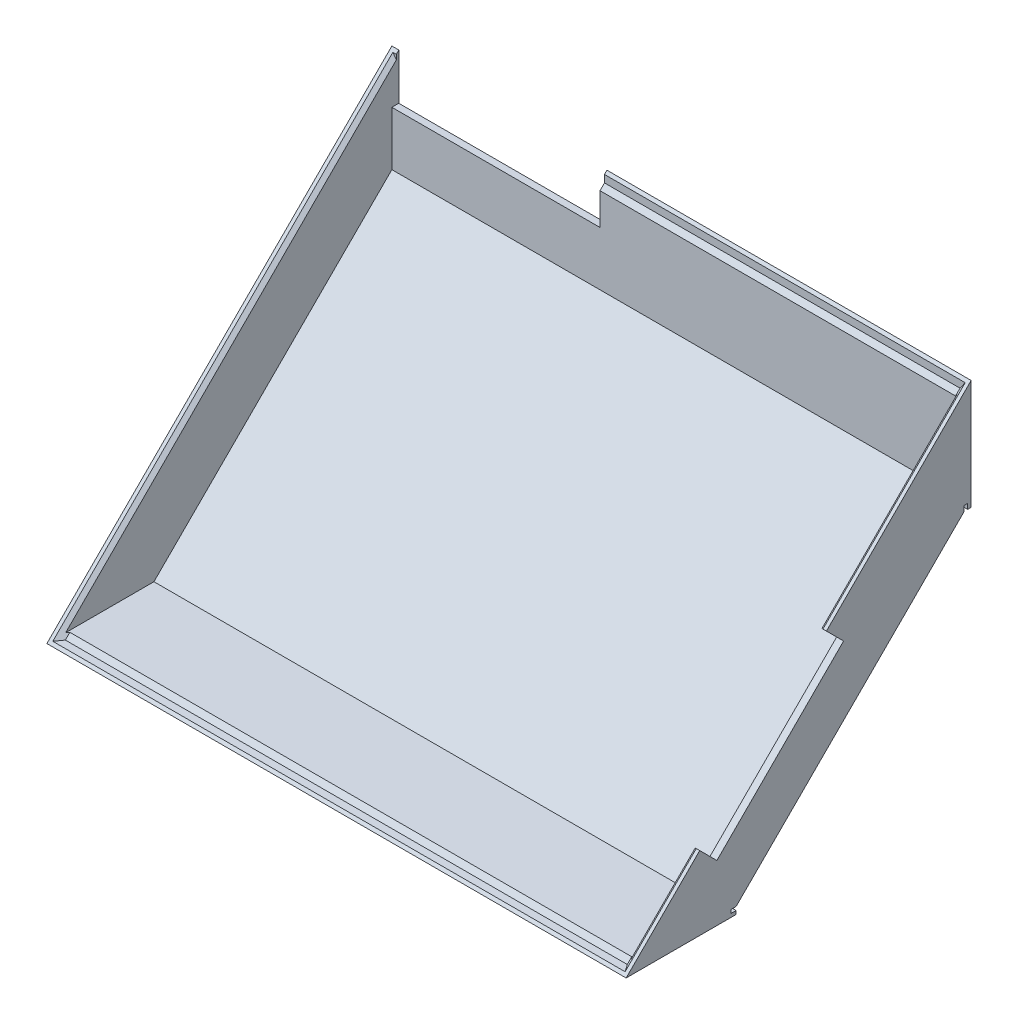
ISO-10303-21;
HEADER;
FILE_DESCRIPTION(('STEP AP214'),'2;1');
FILE_NAME('part.step','',(''),(''),'','','');
FILE_SCHEMA(('AUTOMOTIVE_DESIGN { 1 0 10303 214 1 1 1 1 }'));
ENDSEC;
DATA;
#1=APPLICATION_CONTEXT('core data for automotive mechanical design processes');
#2=APPLICATION_PROTOCOL_DEFINITION('international standard','automotive_design',2000,#1);
#3=PRODUCT_CONTEXT('',#1,'mechanical');
#4=PRODUCT('Part','Part','',(#3));
#5=PRODUCT_RELATED_PRODUCT_CATEGORY('part','',(#4));
#6=PRODUCT_DEFINITION_FORMATION('','',#4);
#7=PRODUCT_DEFINITION_CONTEXT('part definition',#1,'design');
#8=PRODUCT_DEFINITION('design','',#6,#7);
#9=PRODUCT_DEFINITION_SHAPE('','',#8);
#10=(LENGTH_UNIT() NAMED_UNIT(*) SI_UNIT(.MILLI.,.METRE.));
#11=(NAMED_UNIT(*) PLANE_ANGLE_UNIT() SI_UNIT($,.RADIAN.));
#12=(NAMED_UNIT(*) SI_UNIT($,.STERADIAN.) SOLID_ANGLE_UNIT());
#13=UNCERTAINTY_MEASURE_WITH_UNIT(LENGTH_MEASURE(1.E-05),#10,'distance_accuracy_value','');
#14=(GEOMETRIC_REPRESENTATION_CONTEXT(3) GLOBAL_UNCERTAINTY_ASSIGNED_CONTEXT((#13)) GLOBAL_UNIT_ASSIGNED_CONTEXT((#10,
#11,#12)) REPRESENTATION_CONTEXT('',''));
#15=CARTESIAN_POINT('',(0.,0.,0.));
#16=DIRECTION('',(0.,0.,1.));
#17=DIRECTION('',(1.,0.,0.));
#18=AXIS2_PLACEMENT_3D('',#15,#16,#17);
#19=CARTESIAN_POINT('',(167.,99.4594154601834,-99.4594154601844));
#20=DIRECTION('',(0.,-0.707106781186551,-0.707106781186544));
#21=DIRECTION('',(0.,0.707106781186544,-0.707106781186551));
#22=AXIS2_PLACEMENT_3D('',#19,#20,#21);
#23=PLANE('',#22);
#24=DIRECTION('',(0.,-0.707106781186544,0.707106781186551));
#25=VECTOR('',#24,1.);
#26=CARTESIAN_POINT('',(2.00000000000001,43.0799653251739,-43.0799653251743));
#27=LINE('',#26,#25);
#28=CARTESIAN_POINT('',(2.00000000000006,99.4594154601834,-99.4594154601844));
#29=VERTEX_POINT('',#28);
#30=CARTESIAN_POINT('',(2.,98.7523086789969,-98.7523086789978));
#31=VERTEX_POINT('',#30);
#32=EDGE_CURVE('E265',#29,#31,#27,.T.);
#33=ORIENTED_EDGE('',*,*,#32,.F.);
#34=DIRECTION('',(-1.,0.,0.));
#35=VECTOR('',#34,1.);
#36=CARTESIAN_POINT('',(167.,99.4594154601834,-99.4594154601844));
#37=LINE('',#36,#35);
#38=CARTESIAN_POINT('',(0.,99.4594154601834,-99.4594154601844));
#39=VERTEX_POINT('',#38);
#40=EDGE_CURVE('E428',#29,#39,#37,.T.);
#41=ORIENTED_EDGE('',*,*,#40,.T.);
#42=DIRECTION('',(0.,-0.707106781186544,0.707106781186551));
#43=VECTOR('',#42,1.);
#44=CARTESIAN_POINT('',(0.,99.4594154601834,-99.4594154601844));
#45=LINE('',#44,#43);
#46=CARTESIAN_POINT('',(0.,0.,0.));
#47=VERTEX_POINT('',#46);
#48=EDGE_CURVE('E404',#39,#47,#45,.T.);
#49=ORIENTED_EDGE('',*,*,#48,.T.);
#50=DIRECTION('',(-1.,0.,0.));
#51=VECTOR('',#50,1.);
#52=CARTESIAN_POINT('',(167.,0.,0.));
#53=LINE('',#52,#51);
#54=CARTESIAN_POINT('',(167.,0.,0.));
#55=VERTEX_POINT('',#54);
#56=EDGE_CURVE('E422',#55,#47,#53,.T.);
#57=ORIENTED_EDGE('',*,*,#56,.F.);
#58=DIRECTION('',(0.,-0.707106781186544,0.707106781186551));
#59=VECTOR('',#58,1.);
#60=CARTESIAN_POINT('',(167.,99.4594154601834,-99.4594154601844));
#61=LINE('',#60,#59);
#62=CARTESIAN_POINT('',(167.,21.2132034355959,-21.2132034355969));
#63=VERTEX_POINT('',#62);
#64=EDGE_CURVE('E387',#63,#55,#61,.T.);
#65=ORIENTED_EDGE('',*,*,#64,.F.);
#66=DIRECTION('',(1.,0.,0.));
#67=VECTOR('',#66,1.);
#68=CARTESIAN_POINT('',(-0.001000000000001,21.2132034355959,-21.2132034355969));
#69=LINE('',#68,#67);
#70=CARTESIAN_POINT('',(166.,21.2132034355959,-21.2132034355969));
#71=VERTEX_POINT('',#70);
#72=EDGE_CURVE('E518',#71,#63,#69,.T.);
#73=ORIENTED_EDGE('',*,*,#72,.F.);
#74=DIRECTION('',(0.,0.707106781186544,-0.707106781186551));
#75=VECTOR('',#74,1.);
#76=CARTESIAN_POINT('',(166.,0.707106781186544,-0.707106781186551));
#77=LINE('',#76,#75);
#78=CARTESIAN_POINT('',(166.,0.707106781186544,-0.707106781186551));
#79=VERTEX_POINT('',#78);
#80=EDGE_CURVE('E285',#79,#71,#77,.T.);
#81=ORIENTED_EDGE('',*,*,#80,.F.);
#82=DIRECTION('',(1.,0.,0.));
#83=VECTOR('',#82,1.);
#84=CARTESIAN_POINT('',(1.,0.707106781186544,-0.707106781186551));
#85=LINE('',#84,#83);
#86=CARTESIAN_POINT('',(1.,0.707106781186544,-0.707106781186551));
#87=VERTEX_POINT('',#86);
#88=EDGE_CURVE('E275',#87,#79,#85,.T.);
#89=ORIENTED_EDGE('',*,*,#88,.F.);
#90=DIRECTION('',(0.,-0.707106781186544,0.707106781186551));
#91=VECTOR('',#90,1.);
#92=CARTESIAN_POINT('',(1.,98.7523086789969,-98.7523086789978));
#93=LINE('',#92,#91);
#94=CARTESIAN_POINT('',(1.00000000000003,98.7523086789969,-98.7523086789978));
#95=VERTEX_POINT('',#94);
#96=EDGE_CURVE('E268',#95,#87,#93,.T.);
#97=ORIENTED_EDGE('',*,*,#96,.F.);
#98=DIRECTION('',(-1.,0.,0.));
#99=VECTOR('',#98,1.);
#100=CARTESIAN_POINT('',(166.,98.7523086789969,-98.7523086789978));
#101=LINE('',#100,#99);
#102=EDGE_CURVE('E267',#31,#95,#101,.T.);
#103=ORIENTED_EDGE('',*,*,#102,.F.);
#104=EDGE_LOOP('',(#33,#41,#49,#57,#65,#73,#81,#89,#97,#103));
#105=FACE_BOUND('',#104,.T.);
#106=ADVANCED_FACE('F43',(#105),#23,.F.);
#107=DIRECTION('',(0.,0.707106781186544,-0.707106781186551));
#108=VECTOR('',#107,1.);
#109=CARTESIAN_POINT('',(62.,49.7292077300912,-49.7292077300917));
#110=LINE('',#109,#108);
#111=CARTESIAN_POINT('',(62.,98.7523086789969,-98.7523086789978));
#112=VERTEX_POINT('',#111);
#113=CARTESIAN_POINT('',(62.,99.4594154601834,-99.4594154601844));
#114=VERTEX_POINT('',#113);
#115=EDGE_CURVE('E250',#112,#114,#110,.T.);
#116=ORIENTED_EDGE('',*,*,#115,.F.);
#117=CARTESIAN_POINT('',(166.,98.7523086789969,-98.7523086789978));
#118=VERTEX_POINT('',#117);
#119=EDGE_CURVE('E259',#118,#112,#101,.T.);
#120=ORIENTED_EDGE('',*,*,#119,.F.);
#121=CARTESIAN_POINT('',(166.,57.7401153701771,-57.7401153701781));
#122=VERTEX_POINT('',#121);
#123=EDGE_CURVE('E283',#122,#118,#77,.T.);
#124=ORIENTED_EDGE('',*,*,#123,.F.);
#125=DIRECTION('',(1.,0.,0.));
#126=VECTOR('',#125,1.);
#127=CARTESIAN_POINT('',(-0.001000000000001,57.7401153701771,-57.7401153701781));
#128=LINE('',#127,#126);
#129=CARTESIAN_POINT('',(167.,57.7401153701771,-57.7401153701781));
#130=VERTEX_POINT('',#129);
#131=EDGE_CURVE('E519',#122,#130,#128,.T.);
#132=ORIENTED_EDGE('',*,*,#131,.T.);
#133=CARTESIAN_POINT('',(167.,99.4594154601834,-99.4594154601844));
#134=VERTEX_POINT('',#133);
#135=EDGE_CURVE('E389',#134,#130,#61,.T.);
#136=ORIENTED_EDGE('',*,*,#135,.F.);
#137=EDGE_CURVE('E261',#134,#114,#37,.T.);
#138=ORIENTED_EDGE('',*,*,#137,.T.);
#139=EDGE_LOOP('',(#116,#120,#124,#132,#136,#138));
#140=FACE_BOUND('',#139,.T.);
#141=ADVANCED_FACE('F260',(#140),#23,.F.);
#142=CARTESIAN_POINT('',(167.,67.7609306503486,-99.4594154601844));
#143=DIRECTION('',(0.,0.,1.));
#144=DIRECTION('',(1.,0.,0.));
#145=AXIS2_PLACEMENT_3D('',#142,#143,#144);
#146=PLANE('',#145);
#147=DIRECTION('',(0.,-1.,0.));
#148=VECTOR('',#147,1.);
#149=CARTESIAN_POINT('',(62.,99.4594154601834,-99.4594154601844));
#150=LINE('',#149,#148);
#151=CARTESIAN_POINT('',(62.,86.1609306503486,-99.4594154601844));
#152=VERTEX_POINT('',#151);
#153=EDGE_CURVE('E453',#114,#152,#150,.T.);
#154=ORIENTED_EDGE('',*,*,#153,.F.);
#155=ORIENTED_EDGE('',*,*,#137,.F.);
#156=DIRECTION('',(0.,1.,0.));
#157=VECTOR('',#156,1.);
#158=CARTESIAN_POINT('',(167.,67.7609306503486,-99.4594154601844));
#159=LINE('',#158,#157);
#160=CARTESIAN_POINT('',(167.,67.7609306503486,-99.4594154601844));
#161=VERTEX_POINT('',#160);
#162=EDGE_CURVE('E382',#161,#134,#159,.T.);
#163=ORIENTED_EDGE('',*,*,#162,.F.);
#164=DIRECTION('',(-1.,0.,0.));
#165=VECTOR('',#164,1.);
#166=CARTESIAN_POINT('',(167.,67.7609306503486,-99.4594154601844));
#167=LINE('',#166,#165);
#168=CARTESIAN_POINT('',(0.,67.7609306503486,-99.4594154601844));
#169=VERTEX_POINT('',#168);
#170=EDGE_CURVE('E402',#161,#169,#167,.T.);
#171=ORIENTED_EDGE('',*,*,#170,.T.);
#172=DIRECTION('',(0.,1.,0.));
#173=VECTOR('',#172,1.);
#174=CARTESIAN_POINT('',(0.,67.7609306503486,-99.4594154601844));
#175=LINE('',#174,#173);
#176=EDGE_CURVE('E385',#169,#39,#175,.T.);
#177=ORIENTED_EDGE('',*,*,#176,.T.);
#178=ORIENTED_EDGE('',*,*,#40,.F.);
#179=DIRECTION('',(0.,1.,0.));
#180=VECTOR('',#179,1.);
#181=CARTESIAN_POINT('',(2.,86.1609306503486,-99.4594154601844));
#182=LINE('',#181,#180);
#183=CARTESIAN_POINT('',(2.,86.1609306503486,-99.4594154601844));
#184=VERTEX_POINT('',#183);
#185=EDGE_CURVE('E494',#184,#29,#182,.T.);
#186=ORIENTED_EDGE('',*,*,#185,.F.);
#187=DIRECTION('',(-1.,0.,0.));
#188=VECTOR('',#187,1.);
#189=CARTESIAN_POINT('',(62.,86.1609306503486,-99.4594154601844));
#190=LINE('',#189,#188);
#191=EDGE_CURVE('E492',#152,#184,#190,.T.);
#192=ORIENTED_EDGE('',*,*,#191,.F.);
#193=EDGE_LOOP('',(#154,#155,#163,#171,#177,#178,#186,#192));
#194=FACE_BOUND('',#193,.T.);
#195=ADVANCED_FACE('F44',(#194),#146,.F.);
#196=CARTESIAN_POINT('',(166.,98.7523086789969,-98.7523086789978));
#197=DIRECTION('',(0.,0.,-1.));
#198=DIRECTION('',(0.,-1.,0.));
#199=AXIS2_PLACEMENT_3D('',#196,#197,#198);
#200=PLANE('',#199);
#201=DIRECTION('',(-0.577350269189627,0.816496580927726,0.));
#202=VECTOR('',#201,1.);
#203=CARTESIAN_POINT('',(56.0000000000001,20.9705627484766,-98.7523086789973));
#204=LINE('',#203,#202);
#205=CARTESIAN_POINT('',(2.,97.3380951166238,-98.7523086789978));
#206=VERTEX_POINT('',#205);
#207=EDGE_CURVE('E289',#206,#95,#204,.T.);
#208=ORIENTED_EDGE('',*,*,#207,.F.);
#209=DIRECTION('',(0.,-1.,0.));
#210=VECTOR('',#209,1.);
#211=CARTESIAN_POINT('',(2.,86.1609306503479,-98.7523086789978));
#212=LINE('',#211,#210);
#213=EDGE_CURVE('E448',#31,#206,#212,.T.);
#214=ORIENTED_EDGE('',*,*,#213,.F.);
#215=ORIENTED_EDGE('',*,*,#102,.T.);
#216=EDGE_LOOP('',(#208,#214,#215));
#217=FACE_BOUND('',#216,.T.);
#218=ADVANCED_FACE('F454',(#217),#200,.F.);
#219=CARTESIAN_POINT('',(-135.,70.5893577750948,-97.4594154601844));
#220=DIRECTION('',(0.,0.,-1.));
#221=DIRECTION('',(-1.,0.,0.));
#222=AXIS2_PLACEMENT_3D('',#219,#220,#221);
#223=PLANE('',#222);
#224=DIRECTION('',(1.,0.,0.));
#225=VECTOR('',#224,1.);
#226=CARTESIAN_POINT('',(62.,86.1609306503486,-97.4594154601844));
#227=LINE('',#226,#225);
#228=CARTESIAN_POINT('',(2.,86.1609306503486,-97.4594154601844));
#229=VERTEX_POINT('',#228);
#230=CARTESIAN_POINT('',(62.,86.1609306503486,-97.4594154601844));
#231=VERTEX_POINT('',#230);
#232=EDGE_CURVE('E455',#229,#231,#227,.T.);
#233=ORIENTED_EDGE('',*,*,#232,.F.);
#234=DIRECTION('',(0.,1.,0.));
#235=VECTOR('',#234,1.);
#236=CARTESIAN_POINT('',(2.,70.5893577750948,-97.4594154601844));
#237=LINE('',#236,#235);
#238=CARTESIAN_POINT('',(2.,70.5893577750948,-97.4594154601844));
#239=VERTEX_POINT('',#238);
#240=EDGE_CURVE('E376',#239,#229,#237,.T.);
#241=ORIENTED_EDGE('',*,*,#240,.F.);
#242=DIRECTION('',(1.,0.,0.));
#243=VECTOR('',#242,1.);
#244=CARTESIAN_POINT('',(-135.,70.5893577750948,-97.4594154601844));
#245=LINE('',#244,#243);
#246=CARTESIAN_POINT('',(165.,70.5893577750948,-97.4594154601844));
#247=VERTEX_POINT('',#246);
#248=EDGE_CURVE('E375',#239,#247,#245,.T.);
#249=ORIENTED_EDGE('',*,*,#248,.T.);
#250=DIRECTION('',(0.,1.,0.));
#251=VECTOR('',#250,1.);
#252=CARTESIAN_POINT('',(165.,70.5893577750948,-97.4594154601844));
#253=LINE('',#252,#251);
#254=CARTESIAN_POINT('',(165.,96.0452018978104,-97.4594154601844));
#255=VERTEX_POINT('',#254);
#256=EDGE_CURVE('E362',#247,#255,#253,.T.);
#257=ORIENTED_EDGE('',*,*,#256,.T.);
#258=DIRECTION('',(-0.577350269189629,-0.816496580927724,0.));
#259=VECTOR('',#258,1.);
#260=CARTESIAN_POINT('',(52.9999999999989,-62.3467170879765,-97.4594154601844));
#261=LINE('',#260,#259);
#262=CARTESIAN_POINT('',(164.5,95.3380951166238,-97.4594154601844));
#263=VERTEX_POINT('',#262);
#264=EDGE_CURVE('E313',#255,#263,#261,.T.);
#265=ORIENTED_EDGE('',*,*,#264,.T.);
#266=DIRECTION('',(1.,0.,0.));
#267=VECTOR('',#266,1.);
#268=CARTESIAN_POINT('',(-135.,95.3380951166238,-97.4594154601844));
#269=LINE('',#268,#267);
#270=CARTESIAN_POINT('',(62.,95.3380951166238,-97.4594154601844));
#271=VERTEX_POINT('',#270);
#272=EDGE_CURVE('E290',#271,#263,#269,.T.);
#273=ORIENTED_EDGE('',*,*,#272,.F.);
#274=DIRECTION('',(0.,1.,0.));
#275=VECTOR('',#274,1.);
#276=CARTESIAN_POINT('',(62.,99.4594154601834,-97.4594154601844));
#277=LINE('',#276,#275);
#278=EDGE_CURVE('E486',#231,#271,#277,.T.);
#279=ORIENTED_EDGE('',*,*,#278,.F.);
#280=EDGE_LOOP('',(#233,#241,#249,#257,#265,#273,#279));
#281=FACE_BOUND('',#280,.T.);
#282=ADVANCED_FACE('F483',(#281),#223,.F.);
#283=CARTESIAN_POINT('',(166.,0.707106781186544,-0.707106781186551));
#284=DIRECTION('',(0.707106781186546,-0.500000000000003,-0.499999999999999));
#285=DIRECTION('',(-0.707106781186549,-0.500000000000002,-0.499999999999997));
#286=AXIS2_PLACEMENT_3D('',#283,#284,#285);
#287=PLANE('',#286);
#288=DIRECTION('',(0.707106781186549,0.499999999999999,0.499999999999999));
#289=VECTOR('',#288,1.);
#290=CARTESIAN_POINT('',(79.4994999999995,-39.9518866904308,-82.3782935616236));
#291=LINE('',#290,#289);
#292=CARTESIAN_POINT('',(165.,20.5060966544098,-21.9203102167831));
#293=VERTEX_POINT('',#292);
#294=EDGE_CURVE('E502',#293,#71,#291,.T.);
#295=ORIENTED_EDGE('',*,*,#294,.F.);
#296=DIRECTION('',(0.,0.707106781186544,-0.707106781186551));
#297=VECTOR('',#296,1.);
#298=CARTESIAN_POINT('',(165.,-0.707106781186549,-0.707106781186542));
#299=LINE('',#298,#297);
#300=CARTESIAN_POINT('',(165.,1.99999999999999,-3.41421356237309));
#301=VERTEX_POINT('',#300);
#302=EDGE_CURVE('E306',#301,#293,#299,.T.);
#303=ORIENTED_EDGE('',*,*,#302,.F.);
#304=DIRECTION('',(0.577350269189625,0.,0.816496580927726));
#305=VECTOR('',#304,1.);
#306=CARTESIAN_POINT('',(65.6666666666668,2.00000000000001,-143.8927607581));
#307=LINE('',#306,#305);
#308=CARTESIAN_POINT('',(164.5,2.,-4.12132034355965));
#309=VERTEX_POINT('',#308);
#310=EDGE_CURVE('E12',#309,#301,#307,.T.);
#311=ORIENTED_EDGE('',*,*,#310,.F.);
#312=DIRECTION('',(0.,0.707106781186544,-0.707106781186551));
#313=VECTOR('',#312,1.);
#314=CARTESIAN_POINT('',(164.5,-1.06066017177981,-1.06066017177981));
#315=LINE('',#314,#313);
#316=CARTESIAN_POINT('',(164.5,0.707106781186538,-2.82842712474618));
#317=VERTEX_POINT('',#316);
#318=EDGE_CURVE('E295',#317,#309,#315,.T.);
#319=ORIENTED_EDGE('',*,*,#318,.F.);
#320=DIRECTION('',(0.577350269189627,0.,0.816496580927726));
#321=VECTOR('',#320,1.);
#322=CARTESIAN_POINT('',(111.,0.707106781186307,-78.4888527117068));
#323=LINE('',#322,#321);
#324=EDGE_CURVE('E286',#317,#79,#323,.T.);
#325=ORIENTED_EDGE('',*,*,#324,.T.);
#326=ORIENTED_EDGE('',*,*,#80,.T.);
#327=EDGE_LOOP('',(#295,#303,#311,#319,#325,#326));
#328=FACE_BOUND('',#327,.T.);
#329=ADVANCED_FACE('F469',(#328),#287,.F.);
#330=DIRECTION('',(-0.707106781186549,-0.499999999999997,-0.500000000000001));
#331=VECTOR('',#330,1.);
#332=CARTESIAN_POINT('',(79.4994999999996,-3.42497475584949,-118.905205496205));
#333=LINE('',#332,#331);
#334=CARTESIAN_POINT('',(165.,57.0330085889908,-58.4472221513644));
#335=VERTEX_POINT('',#334);
#336=EDGE_CURVE('E274',#122,#335,#333,.T.);
#337=ORIENTED_EDGE('',*,*,#336,.F.);
#338=ORIENTED_EDGE('',*,*,#123,.T.);
#339=DIRECTION('',(0.577350269189627,0.816496580927726,0.));
#340=VECTOR('',#339,1.);
#341=CARTESIAN_POINT('',(119.781048583502,33.388840747123,-98.7523086789974));
#342=LINE('',#341,#340);
#343=CARTESIAN_POINT('',(164.5,96.6309883354373,-98.7523086789978));
#344=VERTEX_POINT('',#343);
#345=EDGE_CURVE('E270',#344,#118,#342,.T.);
#346=ORIENTED_EDGE('',*,*,#345,.F.);
#347=EDGE_CURVE('E296',#263,#344,#315,.T.);
#348=ORIENTED_EDGE('',*,*,#347,.F.);
#349=ORIENTED_EDGE('',*,*,#264,.F.);
#350=EDGE_CURVE('E307',#335,#255,#299,.T.);
#351=ORIENTED_EDGE('',*,*,#350,.F.);
#352=EDGE_LOOP('',(#337,#338,#346,#348,#349,#351));
#353=FACE_BOUND('',#352,.T.);
#354=ADVANCED_FACE('F535',(#353),#287,.F.);
#355=CARTESIAN_POINT('',(167.,0.,0.));
#356=DIRECTION('',(-1.,0.,0.));
#357=DIRECTION('',(0.,0.,1.));
#358=AXIS2_PLACEMENT_3D('',#355,#356,#357);
#359=PLANE('',#358);
#360=DIRECTION('',(0.,-0.707106781186548,-0.707106781186548));
#361=VECTOR('',#360,1.);
#362=CARTESIAN_POINT('',(167.,16.2634559672902,-26.1629509039027));
#363=LINE('',#362,#361);
#364=CARTESIAN_POINT('',(167.,16.2634559672902,-26.1629509039027));
#365=VERTEX_POINT('',#364);
#366=EDGE_CURVE('E510',#63,#365,#363,.T.);
#367=ORIENTED_EDGE('',*,*,#366,.F.);
#368=ORIENTED_EDGE('',*,*,#64,.T.);
#369=DIRECTION('',(0.,0.,-1.));
#370=VECTOR('',#369,1.);
#371=CARTESIAN_POINT('',(167.,0.,0.));
#372=LINE('',#371,#370);
#373=CARTESIAN_POINT('',(167.,0.,-31.6984848098351));
#374=VERTEX_POINT('',#373);
#375=EDGE_CURVE('E393',#55,#374,#372,.T.);
#376=ORIENTED_EDGE('',*,*,#375,.T.);
#377=DIRECTION('',(0.,-1.,0.));
#378=VECTOR('',#377,1.);
#379=CARTESIAN_POINT('',(167.,2.,-31.6984848098351));
#380=LINE('',#379,#378);
#381=CARTESIAN_POINT('',(167.,0.999999999999654,-31.6984848098348));
#382=VERTEX_POINT('',#381);
#383=EDGE_CURVE('E394',#382,#374,#380,.T.);
#384=ORIENTED_EDGE('',*,*,#383,.F.);
#385=DIRECTION('',(0.,0.,-1.));
#386=VECTOR('',#385,1.);
#387=CARTESIAN_POINT('',(167.,0.999999999999529,-30.1984848098353));
#388=LINE('',#387,#386);
#389=CARTESIAN_POINT('',(167.,0.999999999999529,-30.1984848098353));
#390=VERTEX_POINT('',#389);
#391=EDGE_CURVE('E350',#390,#382,#388,.T.);
#392=ORIENTED_EDGE('',*,*,#391,.F.);
#393=DIRECTION('',(0.,-1.,0.));
#394=VECTOR('',#393,1.);
#395=CARTESIAN_POINT('',(167.,1.99999999999953,-30.1984848098353));
#396=LINE('',#395,#394);
#397=CARTESIAN_POINT('',(167.,1.99999999999953,-30.1984848098353));
#398=VERTEX_POINT('',#397);
#399=EDGE_CURVE('E349',#398,#390,#396,.T.);
#400=ORIENTED_EDGE('',*,*,#399,.F.);
#401=DIRECTION('',(0.,0.,1.));
#402=VECTOR('',#401,1.);
#403=CARTESIAN_POINT('',(167.,1.99999999999965,-31.6984848098348));
#404=LINE('',#403,#402);
#405=CARTESIAN_POINT('',(167.,1.99999999999965,-31.6984848098348));
#406=VERTEX_POINT('',#405);
#407=EDGE_CURVE('E329',#406,#398,#404,.T.);
#408=ORIENTED_EDGE('',*,*,#407,.F.);
#409=DIRECTION('',(0.,-0.707106781186544,0.707106781186551));
#410=VECTOR('',#409,1.);
#411=CARTESIAN_POINT('',(167.,67.7609306503486,-97.4594154601844));
#412=LINE('',#411,#410);
#413=CARTESIAN_POINT('',(167.,67.7609306503486,-97.4594154601844));
#414=VERTEX_POINT('',#413);
#415=EDGE_CURVE('E398',#414,#406,#412,.T.);
#416=ORIENTED_EDGE('',*,*,#415,.F.);
#417=DIRECTION('',(0.,-1.,0.));
#418=VECTOR('',#417,1.);
#419=CARTESIAN_POINT('',(167.,67.7609306503486,-97.4594154601844));
#420=LINE('',#419,#418);
#421=CARTESIAN_POINT('',(167.,69.2609306503486,-97.4594154601844));
#422=VERTEX_POINT('',#421);
#423=EDGE_CURVE('E317',#422,#414,#420,.T.);
#424=ORIENTED_EDGE('',*,*,#423,.F.);
#425=DIRECTION('',(0.,0.,1.));
#426=VECTOR('',#425,1.);
#427=CARTESIAN_POINT('',(167.,69.2609306503486,-97.4594154601844));
#428=LINE('',#427,#426);
#429=CARTESIAN_POINT('',(167.,69.2609306503486,-98.4594154601844));
#430=VERTEX_POINT('',#429);
#431=EDGE_CURVE('E328',#430,#422,#428,.T.);
#432=ORIENTED_EDGE('',*,*,#431,.F.);
#433=DIRECTION('',(0.,1.,0.));
#434=VECTOR('',#433,1.);
#435=CARTESIAN_POINT('',(167.,69.2609306503486,-98.4594154601844));
#436=LINE('',#435,#434);
#437=CARTESIAN_POINT('',(167.,67.7609306503486,-98.4594154601844));
#438=VERTEX_POINT('',#437);
#439=EDGE_CURVE('E326',#438,#430,#436,.T.);
#440=ORIENTED_EDGE('',*,*,#439,.F.);
#441=DIRECTION('',(0.,0.,-1.));
#442=VECTOR('',#441,1.);
#443=CARTESIAN_POINT('',(167.,67.7609306503486,-97.4594154601844));
#444=LINE('',#443,#442);
#445=EDGE_CURVE('E399',#438,#161,#444,.T.);
#446=ORIENTED_EDGE('',*,*,#445,.T.);
#447=ORIENTED_EDGE('',*,*,#162,.T.);
#448=ORIENTED_EDGE('',*,*,#135,.T.);
#449=DIRECTION('',(0.,0.707106781186545,0.70710678118655));
#450=VECTOR('',#449,1.);
#451=CARTESIAN_POINT('',(167.,52.7903679018714,-62.6898628384838));
#452=LINE('',#451,#450);
#453=CARTESIAN_POINT('',(167.,52.7903679018714,-62.6898628384838));
#454=VERTEX_POINT('',#453);
#455=EDGE_CURVE('E511',#454,#130,#452,.T.);
#456=ORIENTED_EDGE('',*,*,#455,.F.);
#457=DIRECTION('',(0.,0.707106781186548,-0.707106781186547));
#458=VECTOR('',#457,1.);
#459=CARTESIAN_POINT('',(167.,16.2634559672902,-26.1629509039027));
#460=LINE('',#459,#458);
#461=EDGE_CURVE('E507',#365,#454,#460,.T.);
#462=ORIENTED_EDGE('',*,*,#461,.F.);
#463=EDGE_LOOP('',(#367,#368,#376,#384,#392,#400,#408,#416,#424,#432,#440,#446,#447,#448,#456,#462));
#464=FACE_BOUND('',#463,.T.);
#465=ADVANCED_FACE('F537',(#464),#359,.F.);
#466=CARTESIAN_POINT('',(165.,0.,0.));
#467=DIRECTION('',(1.,0.,0.));
#468=DIRECTION('',(0.,0.,-1.));
#469=AXIS2_PLACEMENT_3D('',#466,#467,#468);
#470=PLANE('',#469);
#471=DIRECTION('',(0.,0.707106781186548,0.707106781186548));
#472=VECTOR('',#471,1.);
#473=CARTESIAN_POINT('',(165.,16.2634559672902,-26.1629509039027));
#474=LINE('',#473,#472);
#475=CARTESIAN_POINT('',(165.,16.2634559672902,-26.1629509039027));
#476=VERTEX_POINT('',#475);
#477=EDGE_CURVE('E501',#476,#293,#474,.T.);
#478=ORIENTED_EDGE('',*,*,#477,.F.);
#479=DIRECTION('',(0.,-0.707106781186548,0.707106781186547));
#480=VECTOR('',#479,1.);
#481=CARTESIAN_POINT('',(165.,16.2634559672902,-26.1629509039027));
#482=LINE('',#481,#480);
#483=CARTESIAN_POINT('',(165.,52.7903679018714,-62.6898628384838));
#484=VERTEX_POINT('',#483);
#485=EDGE_CURVE('E516',#484,#476,#482,.T.);
#486=ORIENTED_EDGE('',*,*,#485,.F.);
#487=DIRECTION('',(0.,-0.707106781186545,-0.70710678118655));
#488=VECTOR('',#487,1.);
#489=CARTESIAN_POINT('',(165.,52.7903679018714,-62.6898628384838));
#490=LINE('',#489,#488);
#491=EDGE_CURVE('E68',#335,#484,#490,.T.);
#492=ORIENTED_EDGE('',*,*,#491,.F.);
#493=ORIENTED_EDGE('',*,*,#350,.T.);
#494=ORIENTED_EDGE('',*,*,#256,.F.);
#495=DIRECTION('',(0.,0.707106781186544,-0.707106781186551));
#496=VECTOR('',#495,1.);
#497=CARTESIAN_POINT('',(165.,2.,-28.8700576850889));
#498=LINE('',#497,#496);
#499=CARTESIAN_POINT('',(165.,2.,-28.8700576850889));
#500=VERTEX_POINT('',#499);
#501=EDGE_CURVE('E368',#500,#247,#498,.T.);
#502=ORIENTED_EDGE('',*,*,#501,.F.);
#503=DIRECTION('',(0.,0.,-1.));
#504=VECTOR('',#503,1.);
#505=CARTESIAN_POINT('',(165.,2.,-2.00000000000002));
#506=LINE('',#505,#504);
#507=EDGE_CURVE('E338',#301,#500,#506,.T.);
#508=ORIENTED_EDGE('',*,*,#507,.F.);
#509=ORIENTED_EDGE('',*,*,#302,.T.);
#510=EDGE_LOOP('',(#478,#486,#492,#493,#494,#502,#508,#509));
#511=FACE_BOUND('',#510,.T.);
#512=ADVANCED_FACE('F475',(#511),#470,.F.);
#513=CARTESIAN_POINT('',(167.,2.,-31.6984848098351));
#514=DIRECTION('',(0.,0.,-1.));
#515=DIRECTION('',(0.,1.,0.));
#516=AXIS2_PLACEMENT_3D('',#513,#514,#515);
#517=PLANE('',#516);
#518=DIRECTION('',(0.,-1.,0.));
#519=VECTOR('',#518,1.);
#520=CARTESIAN_POINT('',(0.,2.,-31.6984848098351));
#521=LINE('',#520,#519);
#522=CARTESIAN_POINT('',(0.,0.999999999999654,-31.6984848098348));
#523=VERTEX_POINT('',#522);
#524=CARTESIAN_POINT('',(0.,0.,-31.6984848098351));
#525=VERTEX_POINT('',#524);
#526=EDGE_CURVE('E409',#523,#525,#521,.T.);
#527=ORIENTED_EDGE('',*,*,#526,.F.);
#528=DIRECTION('',(1.,0.,0.));
#529=VECTOR('',#528,1.);
#530=CARTESIAN_POINT('',(0.,0.999999999999654,-31.6984848098348));
#531=LINE('',#530,#529);
#532=EDGE_CURVE('E314',#523,#382,#531,.T.);
#533=ORIENTED_EDGE('',*,*,#532,.T.);
#534=ORIENTED_EDGE('',*,*,#383,.T.);
#535=DIRECTION('',(-1.,0.,0.));
#536=VECTOR('',#535,1.);
#537=CARTESIAN_POINT('',(167.,0.,-31.6984848098351));
#538=LINE('',#537,#536);
#539=EDGE_CURVE('E425',#374,#525,#538,.T.);
#540=ORIENTED_EDGE('',*,*,#539,.T.);
#541=EDGE_LOOP('',(#527,#533,#534,#540));
#542=FACE_BOUND('',#541,.T.);
#543=ADVANCED_FACE('F586',(#542),#517,.T.);
#544=CARTESIAN_POINT('',(167.,67.7609306503486,-97.4594154601844));
#545=DIRECTION('',(0.,1.,0.));
#546=DIRECTION('',(0.,0.,1.));
#547=AXIS2_PLACEMENT_3D('',#544,#545,#546);
#548=PLANE('',#547);
#549=DIRECTION('',(1.,0.,0.));
#550=VECTOR('',#549,1.);
#551=CARTESIAN_POINT('',(0.,67.7609306503486,-98.4594154601844));
#552=LINE('',#551,#550);
#553=CARTESIAN_POINT('',(0.,67.7609306503486,-98.4594154601844));
#554=VERTEX_POINT('',#553);
#555=EDGE_CURVE('E324',#554,#438,#552,.T.);
#556=ORIENTED_EDGE('',*,*,#555,.F.);
#557=DIRECTION('',(0.,0.,-1.));
#558=VECTOR('',#557,1.);
#559=CARTESIAN_POINT('',(0.,67.7609306503486,-97.4594154601844));
#560=LINE('',#559,#558);
#561=EDGE_CURVE('E390',#554,#169,#560,.T.);
#562=ORIENTED_EDGE('',*,*,#561,.T.);
#563=ORIENTED_EDGE('',*,*,#170,.F.);
#564=ORIENTED_EDGE('',*,*,#445,.F.);
#565=EDGE_LOOP('',(#556,#562,#563,#564));
#566=FACE_BOUND('',#565,.T.);
#567=ADVANCED_FACE('F559',(#566),#548,.F.);
#568=CARTESIAN_POINT('',(0.,0.,0.));
#569=DIRECTION('',(-1.,0.,0.));
#570=DIRECTION('',(0.,0.,1.));
#571=AXIS2_PLACEMENT_3D('',#568,#569,#570);
#572=PLANE('',#571);
#573=DIRECTION('',(0.,0.,1.));
#574=VECTOR('',#573,1.);
#575=CARTESIAN_POINT('',(0.,69.2609306503486,-97.4594154601844));
#576=LINE('',#575,#574);
#577=CARTESIAN_POINT('',(0.,69.2609306503486,-98.4594154601844));
#578=VERTEX_POINT('',#577);
#579=CARTESIAN_POINT('',(0.,69.2609306503486,-97.4594154601844));
#580=VERTEX_POINT('',#579);
#581=EDGE_CURVE('E318',#578,#580,#576,.T.);
#582=ORIENTED_EDGE('',*,*,#581,.T.);
#583=DIRECTION('',(0.,-1.,0.));
#584=VECTOR('',#583,1.);
#585=CARTESIAN_POINT('',(0.,67.7609306503486,-97.4594154601844));
#586=LINE('',#585,#584);
#587=CARTESIAN_POINT('',(0.,67.7609306503486,-97.4594154601844));
#588=VERTEX_POINT('',#587);
#589=EDGE_CURVE('E325',#580,#588,#586,.T.);
#590=ORIENTED_EDGE('',*,*,#589,.T.);
#591=DIRECTION('',(0.,-0.707106781186544,0.707106781186551));
#592=VECTOR('',#591,1.);
#593=CARTESIAN_POINT('',(0.,67.7609306503486,-97.4594154601844));
#594=LINE('',#593,#592);
#595=CARTESIAN_POINT('',(0.,1.99999999999965,-31.6984848098348));
#596=VERTEX_POINT('',#595);
#597=EDGE_CURVE('E413',#588,#596,#594,.T.);
#598=ORIENTED_EDGE('',*,*,#597,.T.);
#599=DIRECTION('',(0.,0.,1.));
#600=VECTOR('',#599,1.);
#601=CARTESIAN_POINT('',(0.,1.99999999999965,-31.6984848098348));
#602=LINE('',#601,#600);
#603=CARTESIAN_POINT('',(0.,1.99999999999953,-30.1984848098353));
#604=VERTEX_POINT('',#603);
#605=EDGE_CURVE('E348',#596,#604,#602,.T.);
#606=ORIENTED_EDGE('',*,*,#605,.T.);
#607=DIRECTION('',(0.,-1.,0.));
#608=VECTOR('',#607,1.);
#609=CARTESIAN_POINT('',(0.,1.99999999999953,-30.1984848098353));
#610=LINE('',#609,#608);
#611=CARTESIAN_POINT('',(0.,0.999999999999529,-30.1984848098353));
#612=VERTEX_POINT('',#611);
#613=EDGE_CURVE('E360',#604,#612,#610,.T.);
#614=ORIENTED_EDGE('',*,*,#613,.T.);
#615=DIRECTION('',(0.,0.,-1.));
#616=VECTOR('',#615,1.);
#617=CARTESIAN_POINT('',(0.,0.999999999999529,-30.1984848098353));
#618=LINE('',#617,#616);
#619=EDGE_CURVE('E345',#612,#523,#618,.T.);
#620=ORIENTED_EDGE('',*,*,#619,.T.);
#621=ORIENTED_EDGE('',*,*,#526,.T.);
#622=DIRECTION('',(0.,0.,-1.));
#623=VECTOR('',#622,1.);
#624=CARTESIAN_POINT('',(0.,0.,0.));
#625=LINE('',#624,#623);
#626=EDGE_CURVE('E408',#47,#525,#625,.T.);
#627=ORIENTED_EDGE('',*,*,#626,.F.);
#628=ORIENTED_EDGE('',*,*,#48,.F.);
#629=ORIENTED_EDGE('',*,*,#176,.F.);
#630=ORIENTED_EDGE('',*,*,#561,.F.);
#631=DIRECTION('',(0.,1.,0.));
#632=VECTOR('',#631,1.);
#633=CARTESIAN_POINT('',(0.,69.2609306503486,-98.4594154601844));
#634=LINE('',#633,#632);
#635=EDGE_CURVE('E312',#554,#578,#634,.T.);
#636=ORIENTED_EDGE('',*,*,#635,.T.);
#637=EDGE_LOOP('',(#582,#590,#598,#606,#614,#620,#621,#627,#628,#629,#630,#636));
#638=FACE_BOUND('',#637,.T.);
#639=ADVANCED_FACE('F553',(#638),#572,.T.);
#640=CARTESIAN_POINT('',(167.,0.,0.));
#641=DIRECTION('',(0.,1.,0.));
#642=DIRECTION('',(0.,0.,1.));
#643=AXIS2_PLACEMENT_3D('',#640,#641,#642);
#644=PLANE('',#643);
#645=ORIENTED_EDGE('',*,*,#626,.T.);
#646=ORIENTED_EDGE('',*,*,#539,.F.);
#647=ORIENTED_EDGE('',*,*,#375,.F.);
#648=ORIENTED_EDGE('',*,*,#56,.T.);
#649=EDGE_LOOP('',(#645,#646,#647,#648));
#650=FACE_BOUND('',#649,.T.);
#651=ADVANCED_FACE('F595',(#650),#644,.F.);
#652=CARTESIAN_POINT('',(167.,67.7609306503486,-97.4594154601844));
#653=DIRECTION('',(0.,-0.707106781186551,-0.707106781186544));
#654=DIRECTION('',(0.,0.707106781186544,-0.707106781186551));
#655=AXIS2_PLACEMENT_3D('',#652,#653,#654);
#656=PLANE('',#655);
#657=ORIENTED_EDGE('',*,*,#597,.F.);
#658=DIRECTION('',(-1.,0.,0.));
#659=VECTOR('',#658,1.);
#660=CARTESIAN_POINT('',(167.,67.7609306503486,-97.4594154601844));
#661=LINE('',#660,#659);
#662=EDGE_CURVE('E417',#414,#588,#661,.T.);
#663=ORIENTED_EDGE('',*,*,#662,.F.);
#664=ORIENTED_EDGE('',*,*,#415,.T.);
#665=DIRECTION('',(-1.,0.,0.));
#666=VECTOR('',#665,1.);
#667=CARTESIAN_POINT('',(167.,2.,-31.6984848098351));
#668=LINE('',#667,#666);
#669=EDGE_CURVE('E420',#406,#596,#668,.T.);
#670=ORIENTED_EDGE('',*,*,#669,.T.);
#671=EDGE_LOOP('',(#657,#663,#664,#670));
#672=FACE_BOUND('',#671,.T.);
#673=ADVANCED_FACE('F571',(#672),#656,.T.);
#674=CARTESIAN_POINT('',(0.,1.99999999999965,-31.6984848098348));
#675=DIRECTION('',(0.,1.,0.));
#676=DIRECTION('',(0.,0.,1.));
#677=AXIS2_PLACEMENT_3D('',#674,#675,#676);
#678=PLANE('',#677);
#679=ORIENTED_EDGE('',*,*,#407,.T.);
#680=DIRECTION('',(1.,0.,0.));
#681=VECTOR('',#680,1.);
#682=CARTESIAN_POINT('',(0.,1.99999999999953,-30.1984848098353));
#683=LINE('',#682,#681);
#684=EDGE_CURVE('E337',#604,#398,#683,.T.);
#685=ORIENTED_EDGE('',*,*,#684,.F.);
#686=ORIENTED_EDGE('',*,*,#605,.F.);
#687=ORIENTED_EDGE('',*,*,#669,.F.);
#688=EDGE_LOOP('',(#679,#685,#686,#687));
#689=FACE_BOUND('',#688,.T.);
#690=ADVANCED_FACE('F580',(#689),#678,.F.);
#691=CARTESIAN_POINT('',(0.,0.999999999999529,-30.1984848098353));
#692=DIRECTION('',(0.,-1.,0.));
#693=DIRECTION('',(0.,0.,-1.));
#694=AXIS2_PLACEMENT_3D('',#691,#692,#693);
#695=PLANE('',#694);
#696=ORIENTED_EDGE('',*,*,#391,.T.);
#697=ORIENTED_EDGE('',*,*,#532,.F.);
#698=ORIENTED_EDGE('',*,*,#619,.F.);
#699=DIRECTION('',(1.,0.,0.));
#700=VECTOR('',#699,1.);
#701=CARTESIAN_POINT('',(0.,0.999999999999529,-30.1984848098353));
#702=LINE('',#701,#700);
#703=EDGE_CURVE('E341',#612,#390,#702,.T.);
#704=ORIENTED_EDGE('',*,*,#703,.T.);
#705=EDGE_LOOP('',(#696,#697,#698,#704));
#706=FACE_BOUND('',#705,.T.);
#707=ADVANCED_FACE('F631',(#706),#695,.F.);
#708=CARTESIAN_POINT('',(0.,1.99999999999953,-30.1984848098353));
#709=DIRECTION('',(0.,0.,1.));
#710=DIRECTION('',(1.,0.,0.));
#711=AXIS2_PLACEMENT_3D('',#708,#709,#710);
#712=PLANE('',#711);
#713=ORIENTED_EDGE('',*,*,#399,.T.);
#714=ORIENTED_EDGE('',*,*,#703,.F.);
#715=ORIENTED_EDGE('',*,*,#613,.F.);
#716=ORIENTED_EDGE('',*,*,#684,.T.);
#717=EDGE_LOOP('',(#713,#714,#715,#716));
#718=FACE_BOUND('',#717,.T.);
#719=ADVANCED_FACE('F581',(#718),#712,.F.);
#720=CARTESIAN_POINT('',(0.,67.7609306503486,-97.4594154601844));
#721=DIRECTION('',(0.,0.,1.));
#722=DIRECTION('',(1.,0.,0.));
#723=AXIS2_PLACEMENT_3D('',#720,#721,#722);
#724=PLANE('',#723);
#725=ORIENTED_EDGE('',*,*,#423,.T.);
#726=ORIENTED_EDGE('',*,*,#662,.T.);
#727=ORIENTED_EDGE('',*,*,#589,.F.);
#728=DIRECTION('',(1.,0.,0.));
#729=VECTOR('',#728,1.);
#730=CARTESIAN_POINT('',(0.,69.2609306503486,-97.4594154601844));
#731=LINE('',#730,#729);
#732=EDGE_CURVE('E331',#580,#422,#731,.T.);
#733=ORIENTED_EDGE('',*,*,#732,.T.);
#734=EDGE_LOOP('',(#725,#726,#727,#733));
#735=FACE_BOUND('',#734,.T.);
#736=ADVANCED_FACE('F569',(#735),#724,.F.);
#737=CARTESIAN_POINT('',(0.,69.2609306503486,-97.4594154601844));
#738=DIRECTION('',(0.,1.,0.));
#739=DIRECTION('',(0.,0.,1.));
#740=AXIS2_PLACEMENT_3D('',#737,#738,#739);
#741=PLANE('',#740);
#742=ORIENTED_EDGE('',*,*,#431,.T.);
#743=ORIENTED_EDGE('',*,*,#732,.F.);
#744=ORIENTED_EDGE('',*,*,#581,.F.);
#745=DIRECTION('',(1.,0.,0.));
#746=VECTOR('',#745,1.);
#747=CARTESIAN_POINT('',(0.,69.2609306503486,-98.4594154601844));
#748=LINE('',#747,#746);
#749=EDGE_CURVE('E340',#578,#430,#748,.T.);
#750=ORIENTED_EDGE('',*,*,#749,.T.);
#751=EDGE_LOOP('',(#742,#743,#744,#750));
#752=FACE_BOUND('',#751,.T.);
#753=ADVANCED_FACE('F567',(#752),#741,.F.);
#754=CARTESIAN_POINT('',(0.,69.2609306503486,-98.4594154601844));
#755=DIRECTION('',(0.,0.,-1.));
#756=DIRECTION('',(-1.,0.,0.));
#757=AXIS2_PLACEMENT_3D('',#754,#755,#756);
#758=PLANE('',#757);
#759=ORIENTED_EDGE('',*,*,#439,.T.);
#760=ORIENTED_EDGE('',*,*,#749,.F.);
#761=ORIENTED_EDGE('',*,*,#635,.F.);
#762=ORIENTED_EDGE('',*,*,#555,.T.);
#763=EDGE_LOOP('',(#759,#760,#761,#762));
#764=FACE_BOUND('',#763,.T.);
#765=ADVANCED_FACE('F565',(#764),#758,.F.);
#766=CARTESIAN_POINT('',(1.,98.7523086789969,-98.7523086789978));
#767=DIRECTION('',(-0.707106781186546,-0.500000000000003,-0.499999999999999));
#768=DIRECTION('',(0.707106781186549,-0.500000000000002,-0.499999999999997));
#769=AXIS2_PLACEMENT_3D('',#766,#767,#768);
#770=PLANE('',#769);
#771=DIRECTION('',(0.,-0.707106781186544,0.707106781186551));
#772=VECTOR('',#771,1.);
#773=CARTESIAN_POINT('',(2.,-0.707106781186554,-0.707106781186547));
#774=LINE('',#773,#772);
#775=CARTESIAN_POINT('',(1.99999999999999,2.,-3.41421356237315));
#776=VERTEX_POINT('',#775);
#777=EDGE_CURVE('E304',#206,#776,#774,.T.);
#778=ORIENTED_EDGE('',*,*,#777,.F.);
#779=ORIENTED_EDGE('',*,*,#207,.T.);
#780=ORIENTED_EDGE('',*,*,#96,.T.);
#781=DIRECTION('',(-0.577350269189627,0.,0.816496580927726));
#782=VECTOR('',#781,1.);
#783=CARTESIAN_POINT('',(47.2189514164976,0.707106781186337,-66.0705747130605));
#784=LINE('',#783,#782);
#785=CARTESIAN_POINT('',(2.49999999999999,0.707106781186538,-2.82842712474618));
#786=VERTEX_POINT('',#785);
#787=EDGE_CURVE('E292',#786,#87,#784,.T.);
#788=ORIENTED_EDGE('',*,*,#787,.F.);
#789=DIRECTION('',(0.,-0.707106781186544,0.707106781186551));
#790=VECTOR('',#789,1.);
#791=CARTESIAN_POINT('',(2.49999999999999,-1.06066017177982,-1.06066017177981));
#792=LINE('',#791,#790);
#793=CARTESIAN_POINT('',(2.49999999999999,2.,-4.12132034355965));
#794=VERTEX_POINT('',#793);
#795=EDGE_CURVE('E298',#794,#786,#792,.T.);
#796=ORIENTED_EDGE('',*,*,#795,.F.);
#797=DIRECTION('',(0.577350269189625,0.,-0.816496580927726));
#798=VECTOR('',#797,1.);
#799=CARTESIAN_POINT('',(-44.3333333333333,1.99999999999999,62.1110148275802));
#800=LINE('',#799,#798);
#801=EDGE_CURVE('E51',#776,#794,#800,.T.);
#802=ORIENTED_EDGE('',*,*,#801,.F.);
#803=EDGE_LOOP('',(#778,#779,#780,#788,#796,#802));
#804=FACE_BOUND('',#803,.T.);
#805=ADVANCED_FACE('F438',(#804),#770,.F.);
#806=CARTESIAN_POINT('',(0.,-1.06066017177982,-1.06066017177981));
#807=DIRECTION('',(0.,0.707106781186551,0.707106781186544));
#808=DIRECTION('',(0.,-0.707106781186544,0.707106781186551));
#809=AXIS2_PLACEMENT_3D('',#806,#807,#808);
#810=PLANE('',#809);
#811=DIRECTION('',(0.,-0.707106781186544,0.707106781186551));
#812=VECTOR('',#811,1.);
#813=CARTESIAN_POINT('',(62.,48.6685475583114,-50.7898679018715));
#814=LINE('',#813,#812);
#815=CARTESIAN_POINT('',(62.,96.6309883354373,-98.7523086789978));
#816=VERTEX_POINT('',#815);
#817=EDGE_CURVE('E59',#816,#271,#814,.T.);
#818=ORIENTED_EDGE('',*,*,#817,.T.);
#819=ORIENTED_EDGE('',*,*,#272,.T.);
#820=ORIENTED_EDGE('',*,*,#347,.T.);
#821=DIRECTION('',(-1.,0.,0.));
#822=VECTOR('',#821,1.);
#823=CARTESIAN_POINT('',(0.,96.6309883354373,-98.7523086789978));
#824=LINE('',#823,#822);
#825=EDGE_CURVE('E282',#344,#816,#824,.T.);
#826=ORIENTED_EDGE('',*,*,#825,.T.);
#827=EDGE_LOOP('',(#818,#819,#820,#826));
#828=FACE_BOUND('',#827,.T.);
#829=ADVANCED_FACE('F532',(#828),#810,.T.);
#830=DIRECTION('',(-1.,0.,0.));
#831=VECTOR('',#830,1.);
#832=CARTESIAN_POINT('',(-135.,2.,-4.12132034355965));
#833=LINE('',#832,#831);
#834=EDGE_CURVE('E429',#309,#794,#833,.T.);
#835=ORIENTED_EDGE('',*,*,#834,.T.);
#836=ORIENTED_EDGE('',*,*,#795,.T.);
#837=DIRECTION('',(1.,0.,0.));
#838=VECTOR('',#837,1.);
#839=CARTESIAN_POINT('',(0.,0.707106781186538,-2.82842712474618));
#840=LINE('',#839,#838);
#841=EDGE_CURVE('E299',#786,#317,#840,.T.);
#842=ORIENTED_EDGE('',*,*,#841,.T.);
#843=ORIENTED_EDGE('',*,*,#318,.T.);
#844=EDGE_LOOP('',(#835,#836,#842,#843));
#845=FACE_BOUND('',#844,.T.);
#846=ADVANCED_FACE('F462',(#845),#810,.T.);
#847=ORIENTED_EDGE('',*,*,#119,.T.);
#848=DIRECTION('',(0.,1.,0.));
#849=VECTOR('',#848,1.);
#850=CARTESIAN_POINT('',(62.,99.4594154601828,-98.7523086789978));
#851=LINE('',#850,#849);
#852=EDGE_CURVE('E241',#816,#112,#851,.T.);
#853=ORIENTED_EDGE('',*,*,#852,.F.);
#854=ORIENTED_EDGE('',*,*,#825,.F.);
#855=ORIENTED_EDGE('',*,*,#345,.T.);
#856=EDGE_LOOP('',(#847,#853,#854,#855));
#857=FACE_BOUND('',#856,.T.);
#858=ADVANCED_FACE('F264',(#857),#200,.F.);
#859=CARTESIAN_POINT('',(1.,0.707106781186544,-0.707106781186551));
#860=DIRECTION('',(0.,-1.,0.));
#861=DIRECTION('',(0.,0.,-1.));
#862=AXIS2_PLACEMENT_3D('',#859,#860,#861);
#863=PLANE('',#862);
#864=ORIENTED_EDGE('',*,*,#88,.T.);
#865=ORIENTED_EDGE('',*,*,#324,.F.);
#866=ORIENTED_EDGE('',*,*,#841,.F.);
#867=ORIENTED_EDGE('',*,*,#787,.T.);
#868=EDGE_LOOP('',(#864,#865,#866,#867));
#869=FACE_BOUND('',#868,.T.);
#870=ADVANCED_FACE('F465',(#869),#863,.F.);
#871=CARTESIAN_POINT('',(-135.,2.,-28.8700576850889));
#872=DIRECTION('',(0.,-0.707106781186551,-0.707106781186544));
#873=DIRECTION('',(0.,0.707106781186544,-0.707106781186551));
#874=AXIS2_PLACEMENT_3D('',#871,#872,#873);
#875=PLANE('',#874);
#876=DIRECTION('',(1.,0.,0.));
#877=VECTOR('',#876,1.);
#878=CARTESIAN_POINT('',(-135.,2.,-28.8700576850889));
#879=LINE('',#878,#877);
#880=CARTESIAN_POINT('',(2.,2.,-28.8700576850889));
#881=VERTEX_POINT('',#880);
#882=EDGE_CURVE('E374',#881,#500,#879,.T.);
#883=ORIENTED_EDGE('',*,*,#882,.T.);
#884=ORIENTED_EDGE('',*,*,#501,.T.);
#885=ORIENTED_EDGE('',*,*,#248,.F.);
#886=DIRECTION('',(0.,0.707106781186544,-0.707106781186551));
#887=VECTOR('',#886,1.);
#888=CARTESIAN_POINT('',(2.,2.,-28.8700576850889));
#889=LINE('',#888,#887);
#890=EDGE_CURVE('E364',#881,#239,#889,.T.);
#891=ORIENTED_EDGE('',*,*,#890,.F.);
#892=EDGE_LOOP('',(#883,#884,#885,#891));
#893=FACE_BOUND('',#892,.T.);
#894=ADVANCED_FACE('F476',(#893),#875,.F.);
#895=CARTESIAN_POINT('',(-135.,2.,-2.00000000000002));
#896=DIRECTION('',(0.,-1.,0.));
#897=DIRECTION('',(0.,0.,-1.));
#898=AXIS2_PLACEMENT_3D('',#895,#896,#897);
#899=PLANE('',#898);
#900=ORIENTED_EDGE('',*,*,#834,.F.);
#901=ORIENTED_EDGE('',*,*,#310,.T.);
#902=ORIENTED_EDGE('',*,*,#507,.T.);
#903=ORIENTED_EDGE('',*,*,#882,.F.);
#904=DIRECTION('',(0.,0.,-1.));
#905=VECTOR('',#904,1.);
#906=CARTESIAN_POINT('',(2.,2.,-2.00000000000002));
#907=LINE('',#906,#905);
#908=EDGE_CURVE('E373',#776,#881,#907,.T.);
#909=ORIENTED_EDGE('',*,*,#908,.F.);
#910=ORIENTED_EDGE('',*,*,#801,.T.);
#911=EDGE_LOOP('',(#900,#901,#902,#903,#909,#910));
#912=FACE_BOUND('',#911,.T.);
#913=ADVANCED_FACE('F434',(#912),#899,.F.);
#914=CARTESIAN_POINT('',(2.,0.,0.));
#915=DIRECTION('',(-1.,0.,0.));
#916=DIRECTION('',(0.,0.,1.));
#917=AXIS2_PLACEMENT_3D('',#914,#915,#916);
#918=PLANE('',#917);
#919=ORIENTED_EDGE('',*,*,#240,.T.);
#920=DIRECTION('',(0.,0.,-1.));
#921=VECTOR('',#920,1.);
#922=CARTESIAN_POINT('',(2.,86.1609306503486,0.001000000000001));
#923=LINE('',#922,#921);
#924=EDGE_CURVE('E479',#229,#184,#923,.T.);
#925=ORIENTED_EDGE('',*,*,#924,.T.);
#926=ORIENTED_EDGE('',*,*,#185,.T.);
#927=ORIENTED_EDGE('',*,*,#32,.T.);
#928=ORIENTED_EDGE('',*,*,#213,.T.);
#929=ORIENTED_EDGE('',*,*,#777,.T.);
#930=ORIENTED_EDGE('',*,*,#908,.T.);
#931=ORIENTED_EDGE('',*,*,#890,.T.);
#932=EDGE_LOOP('',(#919,#925,#926,#927,#928,#929,#930,#931));
#933=FACE_BOUND('',#932,.T.);
#934=ADVANCED_FACE('F444',(#933),#918,.F.);
#935=CARTESIAN_POINT('',(-0.001000000000001,16.2634559672902,-26.1629509039027));
#936=DIRECTION('',(0.,-0.707106781186547,0.707106781186547));
#937=DIRECTION('',(0.,-0.707106781186548,-0.707106781186548));
#938=AXIS2_PLACEMENT_3D('',#935,#936,#937);
#939=PLANE('',#938);
#940=ORIENTED_EDGE('',*,*,#294,.T.);
#941=ORIENTED_EDGE('',*,*,#72,.T.);
#942=ORIENTED_EDGE('',*,*,#366,.T.);
#943=DIRECTION('',(1.,0.,0.));
#944=VECTOR('',#943,1.);
#945=CARTESIAN_POINT('',(-0.001000000000001,16.2634559672902,-26.1629509039027));
#946=LINE('',#945,#944);
#947=EDGE_CURVE('E513',#476,#365,#946,.T.);
#948=ORIENTED_EDGE('',*,*,#947,.F.);
#949=ORIENTED_EDGE('',*,*,#477,.T.);
#950=EDGE_LOOP('',(#940,#941,#942,#948,#949));
#951=FACE_BOUND('',#950,.T.);
#952=ADVANCED_FACE('F594',(#951),#939,.F.);
#953=CARTESIAN_POINT('',(-0.001000000000001,52.7903679018714,-62.6898628384838));
#954=DIRECTION('',(0.,0.70710678118655,-0.707106781186545));
#955=DIRECTION('',(0.,0.707106781186545,0.70710678118655));
#956=AXIS2_PLACEMENT_3D('',#953,#954,#955);
#957=PLANE('',#956);
#958=ORIENTED_EDGE('',*,*,#336,.T.);
#959=ORIENTED_EDGE('',*,*,#491,.T.);
#960=DIRECTION('',(1.,0.,0.));
#961=VECTOR('',#960,1.);
#962=CARTESIAN_POINT('',(-0.001000000000001,52.7903679018714,-62.6898628384838));
#963=LINE('',#962,#961);
#964=EDGE_CURVE('E525',#484,#454,#963,.T.);
#965=ORIENTED_EDGE('',*,*,#964,.T.);
#966=ORIENTED_EDGE('',*,*,#455,.T.);
#967=ORIENTED_EDGE('',*,*,#131,.F.);
#968=EDGE_LOOP('',(#958,#959,#965,#966,#967));
#969=FACE_BOUND('',#968,.T.);
#970=ADVANCED_FACE('F526',(#969),#957,.F.);
#971=CARTESIAN_POINT('',(-0.001000000000001,16.2634559672902,-26.1629509039027));
#972=DIRECTION('',(0.,-0.707106781186547,-0.707106781186548));
#973=DIRECTION('',(0.,0.707106781186548,-0.707106781186547));
#974=AXIS2_PLACEMENT_3D('',#971,#972,#973);
#975=PLANE('',#974);
#976=ORIENTED_EDGE('',*,*,#485,.T.);
#977=ORIENTED_EDGE('',*,*,#947,.T.);
#978=ORIENTED_EDGE('',*,*,#461,.T.);
#979=ORIENTED_EDGE('',*,*,#964,.F.);
#980=EDGE_LOOP('',(#976,#977,#978,#979));
#981=FACE_BOUND('',#980,.T.);
#982=ADVANCED_FACE('F596',(#981),#975,.F.);
#983=CARTESIAN_POINT('',(62.,86.1609306503486,0.001000000000001));
#984=DIRECTION('',(0.,-1.,0.));
#985=DIRECTION('',(0.,0.,-1.));
#986=AXIS2_PLACEMENT_3D('',#983,#984,#985);
#987=PLANE('',#986);
#988=ORIENTED_EDGE('',*,*,#232,.T.);
#989=DIRECTION('',(0.,0.,-1.));
#990=VECTOR('',#989,1.);
#991=CARTESIAN_POINT('',(62.,86.1609306503486,0.001000000000001));
#992=LINE('',#991,#990);
#993=EDGE_CURVE('E500',#231,#152,#992,.T.);
#994=ORIENTED_EDGE('',*,*,#993,.T.);
#995=ORIENTED_EDGE('',*,*,#191,.T.);
#996=ORIENTED_EDGE('',*,*,#924,.F.);
#997=EDGE_LOOP('',(#988,#994,#995,#996));
#998=FACE_BOUND('',#997,.T.);
#999=ADVANCED_FACE('F547',(#998),#987,.F.);
#1000=CARTESIAN_POINT('',(62.,99.4594154601834,0.001000000000001));
#1001=DIRECTION('',(1.,0.,0.));
#1002=DIRECTION('',(0.,0.,-1.));
#1003=AXIS2_PLACEMENT_3D('',#1000,#1001,#1002);
#1004=PLANE('',#1003);
#1005=ORIENTED_EDGE('',*,*,#115,.T.);
#1006=ORIENTED_EDGE('',*,*,#153,.T.);
#1007=ORIENTED_EDGE('',*,*,#993,.F.);
#1008=ORIENTED_EDGE('',*,*,#278,.T.);
#1009=ORIENTED_EDGE('',*,*,#817,.F.);
#1010=ORIENTED_EDGE('',*,*,#852,.T.);
#1011=EDGE_LOOP('',(#1005,#1006,#1007,#1008,#1009,#1010));
#1012=FACE_BOUND('',#1011,.T.);
#1013=ADVANCED_FACE('F242',(#1012),#1004,.F.);
#1014=CLOSED_SHELL('',(#106,#141,#195,#218,#282,#329,#354,#465,#512,#543,#567,#639,#651,#673,
#690,#707,#719,#736,#753,#765,#805,#829,#846,#858,#870,#894,#913,#934,#952,#970,#982,#999,#1013));
#1015=MANIFOLD_SOLID_BREP('B2',#1014);
#1016=ADVANCED_BREP_SHAPE_REPRESENTATION('',(#18,#1015),#14);
#1017=SHAPE_DEFINITION_REPRESENTATION(#9,#1016);
ENDSEC;
END-ISO-10303-21;
